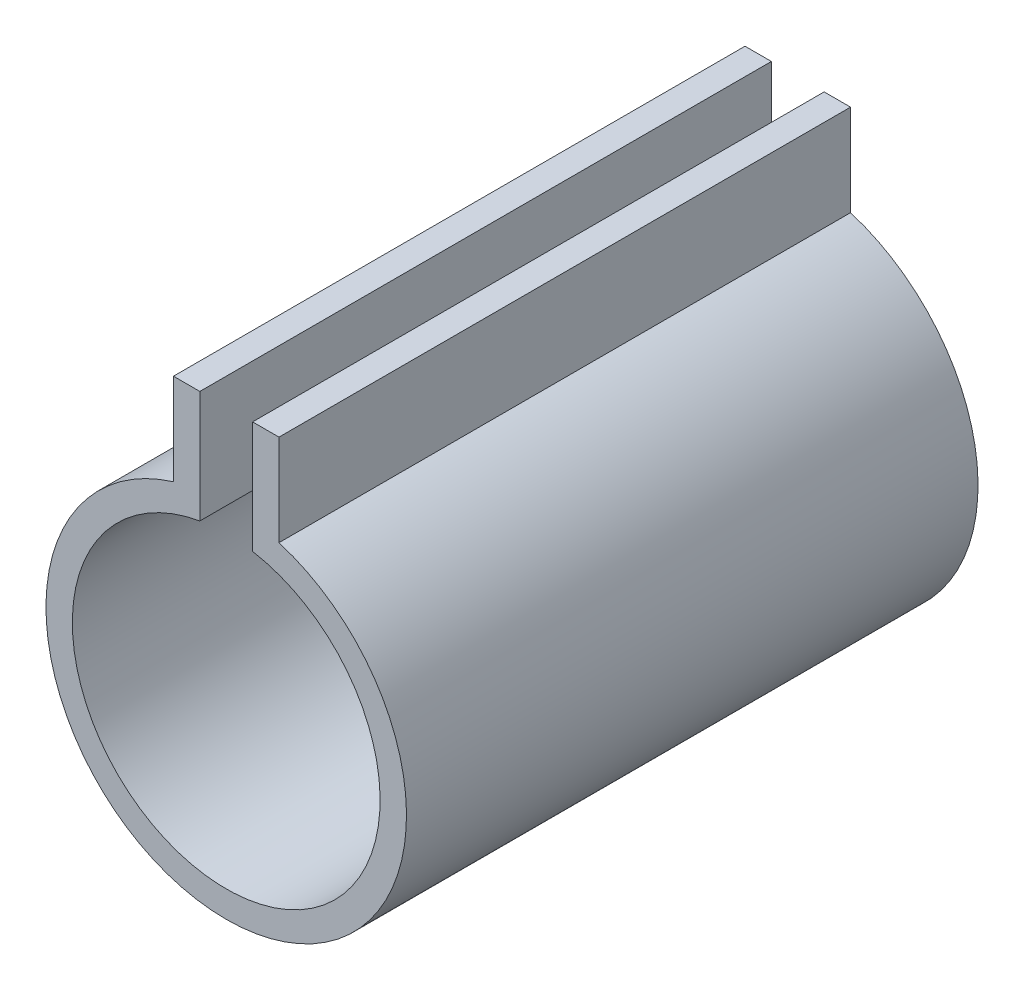
ISO-10303-21;
HEADER;
FILE_DESCRIPTION(('STEP AP214'),'2;1');
FILE_NAME('part.step','',(''),(''),'','','');
FILE_SCHEMA(('AUTOMOTIVE_DESIGN { 1 0 10303 214 1 1 1 1 }'));
ENDSEC;
DATA;
#1=APPLICATION_CONTEXT('core data for automotive mechanical design processes');
#2=APPLICATION_PROTOCOL_DEFINITION('international standard','automotive_design',2000,#1);
#3=PRODUCT_CONTEXT('',#1,'mechanical');
#4=PRODUCT('Part','Part','',(#3));
#5=PRODUCT_RELATED_PRODUCT_CATEGORY('part','',(#4));
#6=PRODUCT_DEFINITION_FORMATION('','',#4);
#7=PRODUCT_DEFINITION_CONTEXT('part definition',#1,'design');
#8=PRODUCT_DEFINITION('design','',#6,#7);
#9=PRODUCT_DEFINITION_SHAPE('','',#8);
#10=(LENGTH_UNIT() NAMED_UNIT(*) SI_UNIT(.MILLI.,.METRE.));
#11=(NAMED_UNIT(*) PLANE_ANGLE_UNIT() SI_UNIT($,.RADIAN.));
#12=(NAMED_UNIT(*) SI_UNIT($,.STERADIAN.) SOLID_ANGLE_UNIT());
#13=UNCERTAINTY_MEASURE_WITH_UNIT(LENGTH_MEASURE(1.E-05),#10,'distance_accuracy_value','');
#14=(GEOMETRIC_REPRESENTATION_CONTEXT(3) GLOBAL_UNCERTAINTY_ASSIGNED_CONTEXT((#13)) GLOBAL_UNIT_ASSIGNED_CONTEXT((#10,
#11,#12)) REPRESENTATION_CONTEXT('',''));
#15=CARTESIAN_POINT('',(0.,0.,0.));
#16=DIRECTION('',(0.,0.,1.));
#17=DIRECTION('',(1.,0.,0.));
#18=AXIS2_PLACEMENT_3D('',#15,#16,#17);
#19=CARTESIAN_POINT('',(0.,0.,65.));
#20=DIRECTION('',(0.,0.,-1.));
#21=DIRECTION('',(-1.,0.,0.));
#22=AXIS2_PLACEMENT_3D('',#19,#20,#21);
#23=CYLINDRICAL_SURFACE('',#22,20.5);
#24=CARTESIAN_POINT('',(0.,0.,0.));
#25=DIRECTION('',(0.,0.,1.));
#26=DIRECTION('',(1.,0.,0.));
#27=AXIS2_PLACEMENT_3D('',#24,#25,#26);
#28=CIRCLE('',#27,20.5);
#29=CARTESIAN_POINT('',(-6.,19.6022957839127,0.));
#30=VERTEX_POINT('',#29);
#31=CARTESIAN_POINT('',(6.,19.6022957839127,0.));
#32=VERTEX_POINT('',#31);
#33=EDGE_CURVE('E140',#30,#32,#28,.T.);
#34=ORIENTED_EDGE('',*,*,#33,.T.);
#35=DIRECTION('',(0.,0.,-1.));
#36=VECTOR('',#35,1.);
#37=CARTESIAN_POINT('',(6.,19.6022957839127,65.));
#38=LINE('',#37,#36);
#39=CARTESIAN_POINT('',(6.,19.6022957839127,65.));
#40=VERTEX_POINT('',#39);
#41=EDGE_CURVE('E11',#40,#32,#38,.T.);
#42=ORIENTED_EDGE('',*,*,#41,.F.);
#43=CARTESIAN_POINT('',(0.,0.,65.));
#44=DIRECTION('',(0.,0.,1.));
#45=DIRECTION('',(1.,0.,0.));
#46=AXIS2_PLACEMENT_3D('',#43,#44,#45);
#47=CIRCLE('',#46,20.5);
#48=CARTESIAN_POINT('',(-6.,19.6022957839127,65.));
#49=VERTEX_POINT('',#48);
#50=EDGE_CURVE('E162',#49,#40,#47,.T.);
#51=ORIENTED_EDGE('',*,*,#50,.F.);
#52=DIRECTION('',(0.,0.,-1.));
#53=VECTOR('',#52,1.);
#54=CARTESIAN_POINT('',(-6.,19.6022957839127,65.));
#55=LINE('',#54,#53);
#56=EDGE_CURVE('E136',#49,#30,#55,.T.);
#57=ORIENTED_EDGE('',*,*,#56,.T.);
#58=EDGE_LOOP('',(#34,#42,#51,#57));
#59=FACE_BOUND('',#58,.T.);
#60=ADVANCED_FACE('F39',(#59),#23,.T.);
#61=CARTESIAN_POINT('',(6.,19.6022957839127,65.));
#62=DIRECTION('',(-1.,0.,0.));
#63=DIRECTION('',(0.,0.,1.));
#64=AXIS2_PLACEMENT_3D('',#61,#62,#63);
#65=PLANE('',#64);
#66=DIRECTION('',(0.,1.,0.));
#67=VECTOR('',#66,1.);
#68=CARTESIAN_POINT('',(6.,19.6022957839127,0.));
#69=LINE('',#68,#67);
#70=CARTESIAN_POINT('',(6.,30.,0.));
#71=VERTEX_POINT('',#70);
#72=EDGE_CURVE('E144',#32,#71,#69,.T.);
#73=ORIENTED_EDGE('',*,*,#72,.T.);
#74=DIRECTION('',(0.,0.,-1.));
#75=VECTOR('',#74,1.);
#76=CARTESIAN_POINT('',(6.,30.,65.));
#77=LINE('',#76,#75);
#78=CARTESIAN_POINT('',(6.,30.,65.));
#79=VERTEX_POINT('',#78);
#80=EDGE_CURVE('E48',#79,#71,#77,.T.);
#81=ORIENTED_EDGE('',*,*,#80,.F.);
#82=DIRECTION('',(0.,1.,0.));
#83=VECTOR('',#82,1.);
#84=CARTESIAN_POINT('',(6.,19.6022957839127,65.));
#85=LINE('',#84,#83);
#86=EDGE_CURVE('E99',#40,#79,#85,.T.);
#87=ORIENTED_EDGE('',*,*,#86,.F.);
#88=ORIENTED_EDGE('',*,*,#41,.T.);
#89=EDGE_LOOP('',(#73,#81,#87,#88));
#90=FACE_BOUND('',#89,.T.);
#91=ADVANCED_FACE('F208',(#90),#65,.F.);
#92=CARTESIAN_POINT('',(3.,30.,65.));
#93=DIRECTION('',(0.,-1.,0.));
#94=DIRECTION('',(0.,0.,-1.));
#95=AXIS2_PLACEMENT_3D('',#92,#93,#94);
#96=PLANE('',#95);
#97=DIRECTION('',(-1.,0.,0.));
#98=VECTOR('',#97,1.);
#99=CARTESIAN_POINT('',(3.,30.,0.));
#100=LINE('',#99,#98);
#101=CARTESIAN_POINT('',(3.,30.,0.));
#102=VERTEX_POINT('',#101);
#103=EDGE_CURVE('E147',#71,#102,#100,.T.);
#104=ORIENTED_EDGE('',*,*,#103,.T.);
#105=DIRECTION('',(0.,0.,-1.));
#106=VECTOR('',#105,1.);
#107=CARTESIAN_POINT('',(3.,30.,65.));
#108=LINE('',#107,#106);
#109=CARTESIAN_POINT('',(3.,30.,65.));
#110=VERTEX_POINT('',#109);
#111=EDGE_CURVE('E173',#110,#102,#108,.T.);
#112=ORIENTED_EDGE('',*,*,#111,.F.);
#113=DIRECTION('',(-1.,0.,0.));
#114=VECTOR('',#113,1.);
#115=CARTESIAN_POINT('',(3.,30.,65.));
#116=LINE('',#115,#114);
#117=EDGE_CURVE('E183',#79,#110,#116,.T.);
#118=ORIENTED_EDGE('',*,*,#117,.F.);
#119=ORIENTED_EDGE('',*,*,#80,.T.);
#120=EDGE_LOOP('',(#104,#112,#118,#119));
#121=FACE_BOUND('',#120,.T.);
#122=ADVANCED_FACE('F181',(#121),#96,.F.);
#123=CARTESIAN_POINT('',(3.,17.2409396495667,65.));
#124=DIRECTION('',(1.,0.,0.));
#125=DIRECTION('',(0.,0.,-1.));
#126=AXIS2_PLACEMENT_3D('',#123,#124,#125);
#127=PLANE('',#126);
#128=DIRECTION('',(0.,-1.,0.));
#129=VECTOR('',#128,1.);
#130=CARTESIAN_POINT('',(3.,17.2409396495667,0.));
#131=LINE('',#130,#129);
#132=CARTESIAN_POINT('',(3.,17.2409396495667,0.));
#133=VERTEX_POINT('',#132);
#134=EDGE_CURVE('E150',#102,#133,#131,.T.);
#135=ORIENTED_EDGE('',*,*,#134,.T.);
#136=DIRECTION('',(0.,0.,-1.));
#137=VECTOR('',#136,1.);
#138=CARTESIAN_POINT('',(3.,17.2409396495667,65.));
#139=LINE('',#138,#137);
#140=CARTESIAN_POINT('',(3.,17.2409396495667,65.));
#141=VERTEX_POINT('',#140);
#142=EDGE_CURVE('E169',#141,#133,#139,.T.);
#143=ORIENTED_EDGE('',*,*,#142,.F.);
#144=DIRECTION('',(0.,-1.,0.));
#145=VECTOR('',#144,1.);
#146=CARTESIAN_POINT('',(3.,17.2409396495667,65.));
#147=LINE('',#146,#145);
#148=EDGE_CURVE('E196',#110,#141,#147,.T.);
#149=ORIENTED_EDGE('',*,*,#148,.F.);
#150=ORIENTED_EDGE('',*,*,#111,.T.);
#151=EDGE_LOOP('',(#135,#143,#149,#150));
#152=FACE_BOUND('',#151,.T.);
#153=ADVANCED_FACE('F191',(#152),#127,.F.);
#154=CARTESIAN_POINT('',(0.,0.,65.));
#155=DIRECTION('',(0.,0.,-1.));
#156=DIRECTION('',(-1.,0.,0.));
#157=AXIS2_PLACEMENT_3D('',#154,#155,#156);
#158=CYLINDRICAL_SURFACE('',#157,17.5);
#159=CARTESIAN_POINT('',(0.,0.,0.));
#160=DIRECTION('',(0.,0.,-1.));
#161=DIRECTION('',(1.,0.,0.));
#162=AXIS2_PLACEMENT_3D('',#159,#160,#161);
#163=CIRCLE('',#162,17.5);
#164=CARTESIAN_POINT('',(-3.,17.2409396495667,0.));
#165=VERTEX_POINT('',#164);
#166=EDGE_CURVE('E153',#133,#165,#163,.T.);
#167=ORIENTED_EDGE('',*,*,#166,.T.);
#168=DIRECTION('',(0.,0.,-1.));
#169=VECTOR('',#168,1.);
#170=CARTESIAN_POINT('',(-3.,17.2409396495667,65.));
#171=LINE('',#170,#169);
#172=CARTESIAN_POINT('',(-3.,17.2409396495667,65.));
#173=VERTEX_POINT('',#172);
#174=EDGE_CURVE('E129',#173,#165,#171,.T.);
#175=ORIENTED_EDGE('',*,*,#174,.F.);
#176=CARTESIAN_POINT('',(0.,0.,65.));
#177=DIRECTION('',(0.,0.,-1.));
#178=DIRECTION('',(1.,0.,0.));
#179=AXIS2_PLACEMENT_3D('',#176,#177,#178);
#180=CIRCLE('',#179,17.5);
#181=EDGE_CURVE('E118',#141,#173,#180,.T.);
#182=ORIENTED_EDGE('',*,*,#181,.F.);
#183=ORIENTED_EDGE('',*,*,#142,.T.);
#184=EDGE_LOOP('',(#167,#175,#182,#183));
#185=FACE_BOUND('',#184,.T.);
#186=ADVANCED_FACE('F194',(#185),#158,.F.);
#187=CARTESIAN_POINT('',(-3.,17.2409396495667,65.));
#188=DIRECTION('',(-1.,0.,0.));
#189=DIRECTION('',(0.,0.,1.));
#190=AXIS2_PLACEMENT_3D('',#187,#188,#189);
#191=PLANE('',#190);
#192=DIRECTION('',(0.,1.,0.));
#193=VECTOR('',#192,1.);
#194=CARTESIAN_POINT('',(-3.,17.2409396495667,0.));
#195=LINE('',#194,#193);
#196=CARTESIAN_POINT('',(-3.,30.,0.));
#197=VERTEX_POINT('',#196);
#198=EDGE_CURVE('E127',#165,#197,#195,.T.);
#199=ORIENTED_EDGE('',*,*,#198,.T.);
#200=DIRECTION('',(0.,0.,-1.));
#201=VECTOR('',#200,1.);
#202=CARTESIAN_POINT('',(-3.,30.,65.));
#203=LINE('',#202,#201);
#204=CARTESIAN_POINT('',(-3.,30.,65.));
#205=VERTEX_POINT('',#204);
#206=EDGE_CURVE('E124',#205,#197,#203,.T.);
#207=ORIENTED_EDGE('',*,*,#206,.F.);
#208=DIRECTION('',(0.,1.,0.));
#209=VECTOR('',#208,1.);
#210=CARTESIAN_POINT('',(-3.,17.2409396495667,65.));
#211=LINE('',#210,#209);
#212=EDGE_CURVE('E112',#173,#205,#211,.T.);
#213=ORIENTED_EDGE('',*,*,#212,.F.);
#214=ORIENTED_EDGE('',*,*,#174,.T.);
#215=EDGE_LOOP('',(#199,#207,#213,#214));
#216=FACE_BOUND('',#215,.T.);
#217=ADVANCED_FACE('F125',(#216),#191,.F.);
#218=CARTESIAN_POINT('',(-3.,30.,65.));
#219=DIRECTION('',(0.,-1.,0.));
#220=DIRECTION('',(0.,0.,-1.));
#221=AXIS2_PLACEMENT_3D('',#218,#219,#220);
#222=PLANE('',#221);
#223=DIRECTION('',(-1.,0.,0.));
#224=VECTOR('',#223,1.);
#225=CARTESIAN_POINT('',(-3.,30.,0.));
#226=LINE('',#225,#224);
#227=CARTESIAN_POINT('',(-6.,30.,0.));
#228=VERTEX_POINT('',#227);
#229=EDGE_CURVE('E85',#197,#228,#226,.T.);
#230=ORIENTED_EDGE('',*,*,#229,.T.);
#231=DIRECTION('',(0.,0.,-1.));
#232=VECTOR('',#231,1.);
#233=CARTESIAN_POINT('',(-6.,30.,65.));
#234=LINE('',#233,#232);
#235=CARTESIAN_POINT('',(-6.,30.,65.));
#236=VERTEX_POINT('',#235);
#237=EDGE_CURVE('E130',#236,#228,#234,.T.);
#238=ORIENTED_EDGE('',*,*,#237,.F.);
#239=DIRECTION('',(-1.,0.,0.));
#240=VECTOR('',#239,1.);
#241=CARTESIAN_POINT('',(-3.,30.,65.));
#242=LINE('',#241,#240);
#243=EDGE_CURVE('E116',#205,#236,#242,.T.);
#244=ORIENTED_EDGE('',*,*,#243,.F.);
#245=ORIENTED_EDGE('',*,*,#206,.T.);
#246=EDGE_LOOP('',(#230,#238,#244,#245));
#247=FACE_BOUND('',#246,.T.);
#248=ADVANCED_FACE('F132',(#247),#222,.F.);
#249=CARTESIAN_POINT('',(-6.,19.6022957839127,65.));
#250=DIRECTION('',(1.,0.,0.));
#251=DIRECTION('',(0.,0.,-1.));
#252=AXIS2_PLACEMENT_3D('',#249,#250,#251);
#253=PLANE('',#252);
#254=DIRECTION('',(0.,-1.,0.));
#255=VECTOR('',#254,1.);
#256=CARTESIAN_POINT('',(-6.,19.6022957839127,0.));
#257=LINE('',#256,#255);
#258=EDGE_CURVE('E91',#228,#30,#257,.T.);
#259=ORIENTED_EDGE('',*,*,#258,.T.);
#260=ORIENTED_EDGE('',*,*,#56,.F.);
#261=DIRECTION('',(0.,-1.,0.));
#262=VECTOR('',#261,1.);
#263=CARTESIAN_POINT('',(-6.,19.6022957839127,65.));
#264=LINE('',#263,#262);
#265=EDGE_CURVE('E56',#236,#49,#264,.T.);
#266=ORIENTED_EDGE('',*,*,#265,.F.);
#267=ORIENTED_EDGE('',*,*,#237,.T.);
#268=EDGE_LOOP('',(#259,#260,#266,#267));
#269=FACE_BOUND('',#268,.T.);
#270=ADVANCED_FACE('F224',(#269),#253,.F.);
#271=CARTESIAN_POINT('',(0.,0.,65.));
#272=DIRECTION('',(0.,0.,1.));
#273=DIRECTION('',(1.,0.,0.));
#274=AXIS2_PLACEMENT_3D('',#271,#272,#273);
#275=PLANE('',#274);
#276=ORIENTED_EDGE('',*,*,#50,.T.);
#277=ORIENTED_EDGE('',*,*,#86,.T.);
#278=ORIENTED_EDGE('',*,*,#117,.T.);
#279=ORIENTED_EDGE('',*,*,#148,.T.);
#280=ORIENTED_EDGE('',*,*,#181,.T.);
#281=ORIENTED_EDGE('',*,*,#212,.T.);
#282=ORIENTED_EDGE('',*,*,#243,.T.);
#283=ORIENTED_EDGE('',*,*,#265,.T.);
#284=EDGE_LOOP('',(#276,#277,#278,#279,#280,#281,#282,#283));
#285=FACE_BOUND('',#284,.T.);
#286=ADVANCED_FACE('F114',(#285),#275,.T.);
#287=CARTESIAN_POINT('',(0.,0.,0.));
#288=DIRECTION('',(0.,0.,1.));
#289=DIRECTION('',(1.,0.,0.));
#290=AXIS2_PLACEMENT_3D('',#287,#288,#289);
#291=PLANE('',#290);
#292=ORIENTED_EDGE('',*,*,#33,.F.);
#293=ORIENTED_EDGE('',*,*,#258,.F.);
#294=ORIENTED_EDGE('',*,*,#229,.F.);
#295=ORIENTED_EDGE('',*,*,#198,.F.);
#296=ORIENTED_EDGE('',*,*,#166,.F.);
#297=ORIENTED_EDGE('',*,*,#134,.F.);
#298=ORIENTED_EDGE('',*,*,#103,.F.);
#299=ORIENTED_EDGE('',*,*,#72,.F.);
#300=EDGE_LOOP('',(#292,#293,#294,#295,#296,#297,#298,#299));
#301=FACE_BOUND('',#300,.T.);
#302=ADVANCED_FACE('F187',(#301),#291,.F.);
#303=CLOSED_SHELL('',(#60,#91,#122,#153,#186,#217,#248,#270,#286,#302));
#304=MANIFOLD_SOLID_BREP('B2',#303);
#305=ADVANCED_BREP_SHAPE_REPRESENTATION('',(#18,#304),#14);
#306=SHAPE_DEFINITION_REPRESENTATION(#9,#305);
ENDSEC;
END-ISO-10303-21;
